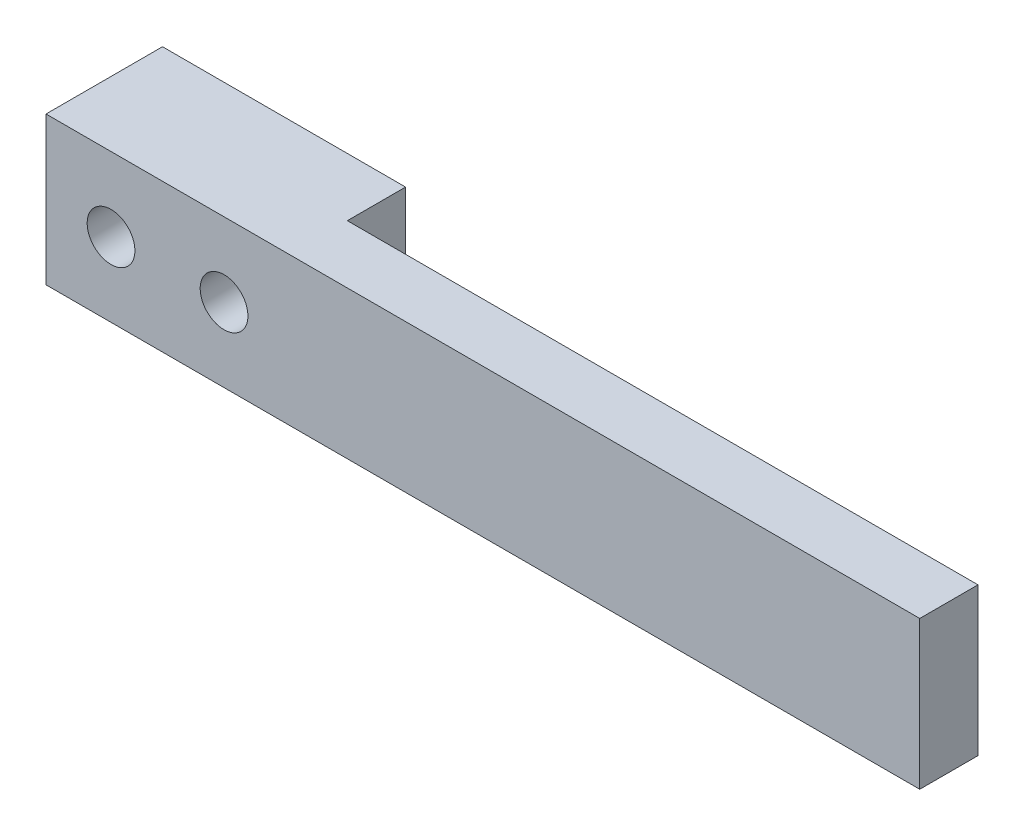
ISO-10303-21;
HEADER;
FILE_DESCRIPTION(('STEP AP214'),'2;1');
FILE_NAME('part.step','',(''),(''),'','','');
FILE_SCHEMA(('AUTOMOTIVE_DESIGN { 1 0 10303 214 1 1 1 1 }'));
ENDSEC;
DATA;
#1=APPLICATION_CONTEXT('core data for automotive mechanical design processes');
#2=APPLICATION_PROTOCOL_DEFINITION('international standard','automotive_design',2000,#1);
#3=PRODUCT_CONTEXT('',#1,'mechanical');
#4=PRODUCT('Part','Part','',(#3));
#5=PRODUCT_RELATED_PRODUCT_CATEGORY('part','',(#4));
#6=PRODUCT_DEFINITION_FORMATION('','',#4);
#7=PRODUCT_DEFINITION_CONTEXT('part definition',#1,'design');
#8=PRODUCT_DEFINITION('design','',#6,#7);
#9=PRODUCT_DEFINITION_SHAPE('','',#8);
#10=(LENGTH_UNIT() NAMED_UNIT(*) SI_UNIT(.MILLI.,.METRE.));
#11=(NAMED_UNIT(*) PLANE_ANGLE_UNIT() SI_UNIT($,.RADIAN.));
#12=(NAMED_UNIT(*) SI_UNIT($,.STERADIAN.) SOLID_ANGLE_UNIT());
#13=UNCERTAINTY_MEASURE_WITH_UNIT(LENGTH_MEASURE(1.E-05),#10,'distance_accuracy_value','');
#14=(GEOMETRIC_REPRESENTATION_CONTEXT(3) GLOBAL_UNCERTAINTY_ASSIGNED_CONTEXT((#13)) GLOBAL_UNIT_ASSIGNED_CONTEXT((#10,
#11,#12)) REPRESENTATION_CONTEXT('',''));
#15=CARTESIAN_POINT('',(0.,0.,0.));
#16=DIRECTION('',(0.,0.,1.));
#17=DIRECTION('',(1.,0.,0.));
#18=AXIS2_PLACEMENT_3D('',#15,#16,#17);
#19=CARTESIAN_POINT('',(-58.5761278195489,12.7,0.));
#20=DIRECTION('',(1.,0.,0.));
#21=DIRECTION('',(0.,0.,-1.));
#22=AXIS2_PLACEMENT_3D('',#19,#20,#21);
#23=PLANE('',#22);
#24=DIRECTION('',(0.,0.,1.));
#25=VECTOR('',#24,1.);
#26=CARTESIAN_POINT('',(-58.5761278195489,0.,0.));
#27=LINE('',#26,#25);
#28=CARTESIAN_POINT('',(-58.5761278195489,0.,-10.));
#29=VERTEX_POINT('',#28);
#30=CARTESIAN_POINT('',(-58.5761278195489,0.,0.));
#31=VERTEX_POINT('',#30);
#32=EDGE_CURVE('E117',#29,#31,#27,.T.);
#33=ORIENTED_EDGE('',*,*,#32,.T.);
#34=DIRECTION('',(0.,-1.,0.));
#35=VECTOR('',#34,1.);
#36=CARTESIAN_POINT('',(-58.5761278195489,12.7,0.));
#37=LINE('',#36,#35);
#38=CARTESIAN_POINT('',(-58.5761278195489,12.7,0.));
#39=VERTEX_POINT('',#38);
#40=EDGE_CURVE('E11',#39,#31,#37,.T.);
#41=ORIENTED_EDGE('',*,*,#40,.F.);
#42=DIRECTION('',(0.,0.,1.));
#43=VECTOR('',#42,1.);
#44=CARTESIAN_POINT('',(-58.5761278195489,12.7,0.));
#45=LINE('',#44,#43);
#46=CARTESIAN_POINT('',(-58.5761278195489,12.7,-10.));
#47=VERTEX_POINT('',#46);
#48=EDGE_CURVE('E128',#47,#39,#45,.T.);
#49=ORIENTED_EDGE('',*,*,#48,.F.);
#50=DIRECTION('',(0.,-1.,0.));
#51=VECTOR('',#50,1.);
#52=CARTESIAN_POINT('',(-58.5761278195489,12.7,-10.));
#53=LINE('',#52,#51);
#54=EDGE_CURVE('E113',#47,#29,#53,.T.);
#55=ORIENTED_EDGE('',*,*,#54,.T.);
#56=EDGE_LOOP('',(#33,#41,#49,#55));
#57=FACE_BOUND('',#56,.T.);
#58=ADVANCED_FACE('F33',(#57),#23,.F.);
#59=CARTESIAN_POINT('',(-58.5761278195489,12.7,0.));
#60=DIRECTION('',(0.,0.,-1.));
#61=DIRECTION('',(-1.,0.,0.));
#62=AXIS2_PLACEMENT_3D('',#59,#60,#61);
#63=PLANE('',#62);
#64=CARTESIAN_POINT('',(-43.2937969924812,6.35,0.));
#65=DIRECTION('',(0.,0.,-1.));
#66=DIRECTION('',(-1.,0.,0.));
#67=AXIS2_PLACEMENT_3D('',#64,#65,#66);
#68=CIRCLE('',#67,2.05);
#69=CARTESIAN_POINT('',(-45.3437969924812,6.35,0.));
#70=VERTEX_POINT('',#69);
#71=EDGE_CURVE('E121',#70,#70,#68,.T.);
#72=ORIENTED_EDGE('',*,*,#71,.T.);
#73=EDGE_LOOP('',(#72));
#74=FACE_BOUND('',#73,.T.);
#75=CARTESIAN_POINT('',(-52.9937969924812,6.35,0.));
#76=DIRECTION('',(0.,0.,-1.));
#77=DIRECTION('',(-1.,0.,0.));
#78=AXIS2_PLACEMENT_3D('',#75,#76,#77);
#79=CIRCLE('',#78,2.05);
#80=CARTESIAN_POINT('',(-55.0437969924812,6.35,0.));
#81=VERTEX_POINT('',#80);
#82=EDGE_CURVE('E227',#81,#81,#79,.T.);
#83=ORIENTED_EDGE('',*,*,#82,.T.);
#84=EDGE_LOOP('',(#83));
#85=FACE_BOUND('',#84,.T.);
#86=DIRECTION('',(1.,0.,0.));
#87=VECTOR('',#86,1.);
#88=CARTESIAN_POINT('',(-58.5761278195489,0.,0.));
#89=LINE('',#88,#87);
#90=CARTESIAN_POINT('',(16.4238721804511,0.,0.));
#91=VERTEX_POINT('',#90);
#92=EDGE_CURVE('E120',#31,#91,#89,.T.);
#93=ORIENTED_EDGE('',*,*,#92,.T.);
#94=DIRECTION('',(0.,-1.,0.));
#95=VECTOR('',#94,1.);
#96=CARTESIAN_POINT('',(16.4238721804511,12.7,0.));
#97=LINE('',#96,#95);
#98=CARTESIAN_POINT('',(16.4238721804511,12.7,0.));
#99=VERTEX_POINT('',#98);
#100=EDGE_CURVE('E41',#99,#91,#97,.T.);
#101=ORIENTED_EDGE('',*,*,#100,.F.);
#102=DIRECTION('',(1.,0.,0.));
#103=VECTOR('',#102,1.);
#104=CARTESIAN_POINT('',(-58.5761278195489,12.7,0.));
#105=LINE('',#104,#103);
#106=EDGE_CURVE('E86',#39,#99,#105,.T.);
#107=ORIENTED_EDGE('',*,*,#106,.F.);
#108=ORIENTED_EDGE('',*,*,#40,.T.);
#109=EDGE_LOOP('',(#93,#101,#107,#108));
#110=FACE_BOUND('',#109,.T.);
#111=ADVANCED_FACE('F155',(#74,#85,#110),#63,.F.);
#112=CARTESIAN_POINT('',(16.4238721804511,12.7,0.));
#113=DIRECTION('',(-1.,0.,0.));
#114=DIRECTION('',(0.,0.,1.));
#115=AXIS2_PLACEMENT_3D('',#112,#113,#114);
#116=PLANE('',#115);
#117=DIRECTION('',(0.,0.,-1.));
#118=VECTOR('',#117,1.);
#119=CARTESIAN_POINT('',(16.4238721804511,0.,0.));
#120=LINE('',#119,#118);
#121=CARTESIAN_POINT('',(16.4238721804511,0.,-5.));
#122=VERTEX_POINT('',#121);
#123=EDGE_CURVE('E123',#91,#122,#120,.T.);
#124=ORIENTED_EDGE('',*,*,#123,.T.);
#125=DIRECTION('',(0.,-1.,0.));
#126=VECTOR('',#125,1.);
#127=CARTESIAN_POINT('',(16.4238721804511,12.7,-5.));
#128=LINE('',#127,#126);
#129=CARTESIAN_POINT('',(16.4238721804511,12.7,-5.));
#130=VERTEX_POINT('',#129);
#131=EDGE_CURVE('E108',#130,#122,#128,.T.);
#132=ORIENTED_EDGE('',*,*,#131,.F.);
#133=DIRECTION('',(0.,0.,-1.));
#134=VECTOR('',#133,1.);
#135=CARTESIAN_POINT('',(16.4238721804511,12.7,0.));
#136=LINE('',#135,#134);
#137=EDGE_CURVE('E99',#99,#130,#136,.T.);
#138=ORIENTED_EDGE('',*,*,#137,.F.);
#139=ORIENTED_EDGE('',*,*,#100,.T.);
#140=EDGE_LOOP('',(#124,#132,#138,#139));
#141=FACE_BOUND('',#140,.T.);
#142=ADVANCED_FACE('F134',(#141),#116,.F.);
#143=CARTESIAN_POINT('',(16.4238721804511,12.7,-5.));
#144=DIRECTION('',(0.,0.,1.));
#145=DIRECTION('',(1.,0.,0.));
#146=AXIS2_PLACEMENT_3D('',#143,#144,#145);
#147=PLANE('',#146);
#148=DIRECTION('',(-1.,0.,0.));
#149=VECTOR('',#148,1.);
#150=CARTESIAN_POINT('',(16.4238721804511,0.,-5.));
#151=LINE('',#150,#149);
#152=CARTESIAN_POINT('',(-37.7114661654135,0.,-4.99999999999999));
#153=VERTEX_POINT('',#152);
#154=EDGE_CURVE('E107',#122,#153,#151,.T.);
#155=ORIENTED_EDGE('',*,*,#154,.T.);
#156=DIRECTION('',(0.,-1.,0.));
#157=VECTOR('',#156,1.);
#158=CARTESIAN_POINT('',(-37.7114661654135,12.7,-4.99999999999999));
#159=LINE('',#158,#157);
#160=CARTESIAN_POINT('',(-37.7114661654135,12.7,-4.99999999999999));
#161=VERTEX_POINT('',#160);
#162=EDGE_CURVE('E104',#161,#153,#159,.T.);
#163=ORIENTED_EDGE('',*,*,#162,.F.);
#164=DIRECTION('',(-1.,0.,0.));
#165=VECTOR('',#164,1.);
#166=CARTESIAN_POINT('',(16.4238721804511,12.7,-5.));
#167=LINE('',#166,#165);
#168=EDGE_CURVE('E93',#130,#161,#167,.T.);
#169=ORIENTED_EDGE('',*,*,#168,.F.);
#170=ORIENTED_EDGE('',*,*,#131,.T.);
#171=EDGE_LOOP('',(#155,#163,#169,#170));
#172=FACE_BOUND('',#171,.T.);
#173=ADVANCED_FACE('F105',(#172),#147,.F.);
#174=CARTESIAN_POINT('',(-37.7114661654135,12.7,-4.99999999999999));
#175=DIRECTION('',(-1.,0.,0.));
#176=DIRECTION('',(0.,0.,1.));
#177=AXIS2_PLACEMENT_3D('',#174,#175,#176);
#178=PLANE('',#177);
#179=DIRECTION('',(0.,0.,-1.));
#180=VECTOR('',#179,1.);
#181=CARTESIAN_POINT('',(-37.7114661654135,0.,-4.99999999999999));
#182=LINE('',#181,#180);
#183=CARTESIAN_POINT('',(-37.7114661654135,0.,-10.));
#184=VERTEX_POINT('',#183);
#185=EDGE_CURVE('E72',#153,#184,#182,.T.);
#186=ORIENTED_EDGE('',*,*,#185,.T.);
#187=DIRECTION('',(0.,-1.,0.));
#188=VECTOR('',#187,1.);
#189=CARTESIAN_POINT('',(-37.7114661654135,12.7,-10.));
#190=LINE('',#189,#188);
#191=CARTESIAN_POINT('',(-37.7114661654135,12.7,-10.));
#192=VERTEX_POINT('',#191);
#193=EDGE_CURVE('E109',#192,#184,#190,.T.);
#194=ORIENTED_EDGE('',*,*,#193,.F.);
#195=DIRECTION('',(0.,0.,-1.));
#196=VECTOR('',#195,1.);
#197=CARTESIAN_POINT('',(-37.7114661654135,12.7,-4.99999999999999));
#198=LINE('',#197,#196);
#199=EDGE_CURVE('E97',#161,#192,#198,.T.);
#200=ORIENTED_EDGE('',*,*,#199,.F.);
#201=ORIENTED_EDGE('',*,*,#162,.T.);
#202=EDGE_LOOP('',(#186,#194,#200,#201));
#203=FACE_BOUND('',#202,.T.);
#204=ADVANCED_FACE('F111',(#203),#178,.F.);
#205=CARTESIAN_POINT('',(-58.5761278195489,12.7,-10.));
#206=DIRECTION('',(0.,0.,1.));
#207=DIRECTION('',(1.,0.,0.));
#208=AXIS2_PLACEMENT_3D('',#205,#206,#207);
#209=PLANE('',#208);
#210=CARTESIAN_POINT('',(-43.2937969924812,6.35,-10.));
#211=DIRECTION('',(0.,0.,-1.));
#212=DIRECTION('',(-1.,0.,0.));
#213=AXIS2_PLACEMENT_3D('',#210,#211,#212);
#214=CIRCLE('',#213,2.05);
#215=CARTESIAN_POINT('',(-45.3437969924812,6.35,-10.));
#216=VERTEX_POINT('',#215);
#217=EDGE_CURVE('E225',#216,#216,#214,.T.);
#218=ORIENTED_EDGE('',*,*,#217,.F.);
#219=EDGE_LOOP('',(#218));
#220=FACE_BOUND('',#219,.T.);
#221=CARTESIAN_POINT('',(-52.9937969924812,6.35,-10.));
#222=DIRECTION('',(0.,0.,-1.));
#223=DIRECTION('',(-1.,0.,0.));
#224=AXIS2_PLACEMENT_3D('',#221,#222,#223);
#225=CIRCLE('',#224,2.05);
#226=CARTESIAN_POINT('',(-55.0437969924812,6.35,-10.));
#227=VERTEX_POINT('',#226);
#228=EDGE_CURVE('E234',#227,#227,#225,.T.);
#229=ORIENTED_EDGE('',*,*,#228,.F.);
#230=EDGE_LOOP('',(#229));
#231=FACE_BOUND('',#230,.T.);
#232=DIRECTION('',(-1.,0.,0.));
#233=VECTOR('',#232,1.);
#234=CARTESIAN_POINT('',(-58.5761278195489,0.,-10.));
#235=LINE('',#234,#233);
#236=EDGE_CURVE('E78',#184,#29,#235,.T.);
#237=ORIENTED_EDGE('',*,*,#236,.T.);
#238=ORIENTED_EDGE('',*,*,#54,.F.);
#239=DIRECTION('',(-1.,0.,0.));
#240=VECTOR('',#239,1.);
#241=CARTESIAN_POINT('',(-58.5761278195489,12.7,-10.));
#242=LINE('',#241,#240);
#243=EDGE_CURVE('E49',#192,#47,#242,.T.);
#244=ORIENTED_EDGE('',*,*,#243,.F.);
#245=ORIENTED_EDGE('',*,*,#193,.T.);
#246=EDGE_LOOP('',(#237,#238,#244,#245));
#247=FACE_BOUND('',#246,.T.);
#248=ADVANCED_FACE('F141',(#220,#231,#247),#209,.F.);
#249=CARTESIAN_POINT('',(0.,12.7,0.));
#250=DIRECTION('',(0.,-1.,0.));
#251=DIRECTION('',(0.,0.,-1.));
#252=AXIS2_PLACEMENT_3D('',#249,#250,#251);
#253=PLANE('',#252);
#254=ORIENTED_EDGE('',*,*,#48,.T.);
#255=ORIENTED_EDGE('',*,*,#106,.T.);
#256=ORIENTED_EDGE('',*,*,#137,.T.);
#257=ORIENTED_EDGE('',*,*,#168,.T.);
#258=ORIENTED_EDGE('',*,*,#199,.T.);
#259=ORIENTED_EDGE('',*,*,#243,.T.);
#260=EDGE_LOOP('',(#254,#255,#256,#257,#258,#259));
#261=FACE_BOUND('',#260,.T.);
#262=ADVANCED_FACE('F95',(#261),#253,.F.);
#263=CARTESIAN_POINT('',(0.,0.,0.));
#264=DIRECTION('',(0.,-1.,0.));
#265=DIRECTION('',(0.,0.,-1.));
#266=AXIS2_PLACEMENT_3D('',#263,#264,#265);
#267=PLANE('',#266);
#268=ORIENTED_EDGE('',*,*,#32,.F.);
#269=ORIENTED_EDGE('',*,*,#236,.F.);
#270=ORIENTED_EDGE('',*,*,#185,.F.);
#271=ORIENTED_EDGE('',*,*,#154,.F.);
#272=ORIENTED_EDGE('',*,*,#123,.F.);
#273=ORIENTED_EDGE('',*,*,#92,.F.);
#274=EDGE_LOOP('',(#268,#269,#270,#271,#272,#273));
#275=FACE_BOUND('',#274,.T.);
#276=ADVANCED_FACE('F137',(#275),#267,.T.);
#277=CARTESIAN_POINT('',(-52.9937969924812,6.35,2.7));
#278=DIRECTION('',(0.,0.,-1.));
#279=DIRECTION('',(-1.,0.,0.));
#280=AXIS2_PLACEMENT_3D('',#277,#278,#279);
#281=CYLINDRICAL_SURFACE('',#280,2.05);
#282=ORIENTED_EDGE('',*,*,#228,.T.);
#283=EDGE_LOOP('',(#282));
#284=FACE_BOUND('',#283,.T.);
#285=ORIENTED_EDGE('',*,*,#82,.F.);
#286=EDGE_LOOP('',(#285));
#287=FACE_BOUND('',#286,.T.);
#288=ADVANCED_FACE('F191',(#284,#287),#281,.F.);
#289=CARTESIAN_POINT('',(-43.2937969924812,6.35,2.7));
#290=DIRECTION('',(0.,0.,-1.));
#291=DIRECTION('',(-1.,0.,0.));
#292=AXIS2_PLACEMENT_3D('',#289,#290,#291);
#293=CYLINDRICAL_SURFACE('',#292,2.05);
#294=ORIENTED_EDGE('',*,*,#217,.T.);
#295=EDGE_LOOP('',(#294));
#296=FACE_BOUND('',#295,.T.);
#297=ORIENTED_EDGE('',*,*,#71,.F.);
#298=EDGE_LOOP('',(#297));
#299=FACE_BOUND('',#298,.T.);
#300=ADVANCED_FACE('F209',(#296,#299),#293,.F.);
#301=CLOSED_SHELL('',(#58,#111,#142,#173,#204,#248,#262,#276,#288,#300));
#302=MANIFOLD_SOLID_BREP('B2',#301);
#303=ADVANCED_BREP_SHAPE_REPRESENTATION('',(#18,#302),#14);
#304=SHAPE_DEFINITION_REPRESENTATION(#9,#303);
ENDSEC;
END-ISO-10303-21;
